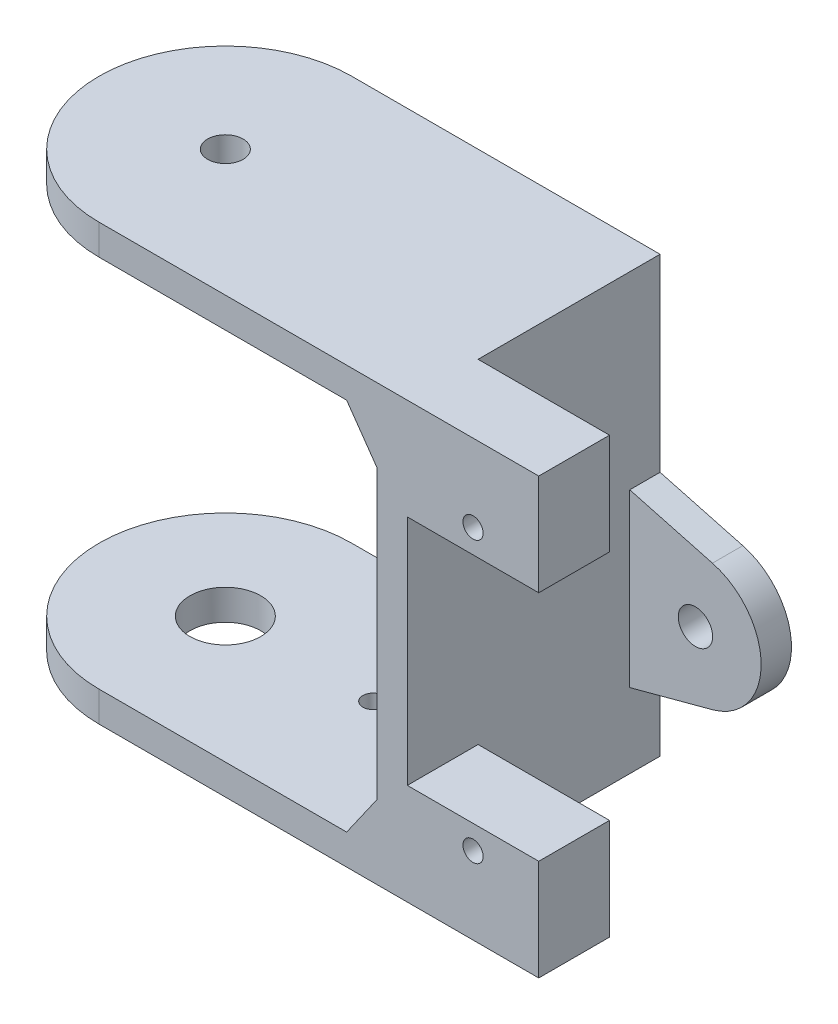
ISO-10303-21;
HEADER;
FILE_DESCRIPTION(('STEP AP214'),'2;1');
FILE_NAME('part.step','',(''),(''),'','','');
FILE_SCHEMA(('AUTOMOTIVE_DESIGN { 1 0 10303 214 1 1 1 1 }'));
ENDSEC;
DATA;
#1=APPLICATION_CONTEXT('core data for automotive mechanical design processes');
#2=APPLICATION_PROTOCOL_DEFINITION('international standard','automotive_design',2000,#1);
#3=PRODUCT_CONTEXT('',#1,'mechanical');
#4=PRODUCT('Part','Part','',(#3));
#5=PRODUCT_RELATED_PRODUCT_CATEGORY('part','',(#4));
#6=PRODUCT_DEFINITION_FORMATION('','',#4);
#7=PRODUCT_DEFINITION_CONTEXT('part definition',#1,'design');
#8=PRODUCT_DEFINITION('design','',#6,#7);
#9=PRODUCT_DEFINITION_SHAPE('','',#8);
#10=(LENGTH_UNIT() NAMED_UNIT(*) SI_UNIT(.MILLI.,.METRE.));
#11=(NAMED_UNIT(*) PLANE_ANGLE_UNIT() SI_UNIT($,.RADIAN.));
#12=(NAMED_UNIT(*) SI_UNIT($,.STERADIAN.) SOLID_ANGLE_UNIT());
#13=UNCERTAINTY_MEASURE_WITH_UNIT(LENGTH_MEASURE(1.E-05),#10,'distance_accuracy_value','');
#14=(GEOMETRIC_REPRESENTATION_CONTEXT(3) GLOBAL_UNCERTAINTY_ASSIGNED_CONTEXT((#13)) GLOBAL_UNIT_ASSIGNED_CONTEXT((#10,
#11,#12)) REPRESENTATION_CONTEXT('',''));
#15=CARTESIAN_POINT('',(0.,0.,0.));
#16=DIRECTION('',(0.,0.,1.));
#17=DIRECTION('',(1.,0.,0.));
#18=AXIS2_PLACEMENT_3D('',#15,#16,#17);
#19=CARTESIAN_POINT('',(-43.,21.5,12.5));
#20=DIRECTION('',(0.,1.,0.));
#21=DIRECTION('',(1.,0.,0.));
#22=AXIS2_PLACEMENT_3D('',#19,#20,#21);
#23=PLANE('',#22);
#24=DIRECTION('',(0.,0.,-1.));
#25=VECTOR('',#24,1.);
#26=CARTESIAN_POINT('',(13.,21.5,12.5));
#27=LINE('',#26,#25);
#28=CARTESIAN_POINT('',(13.,21.5,12.5));
#29=VERTEX_POINT('',#28);
#30=CARTESIAN_POINT('',(13.,21.4999999999999,5.5));
#31=VERTEX_POINT('',#30);
#32=EDGE_CURVE('E413',#29,#31,#27,.T.);
#33=ORIENTED_EDGE('',*,*,#32,.F.);
#34=DIRECTION('',(-1.,0.,0.));
#35=VECTOR('',#34,1.);
#36=CARTESIAN_POINT('',(0.,21.5,12.5));
#37=LINE('',#36,#35);
#38=CARTESIAN_POINT('',(-30.5,21.5,12.5));
#39=VERTEX_POINT('',#38);
#40=EDGE_CURVE('E408',#29,#39,#37,.T.);
#41=ORIENTED_EDGE('',*,*,#40,.T.);
#42=CARTESIAN_POINT('',(-30.5,21.5,0.));
#43=DIRECTION('',(0.,-1.,0.));
#44=DIRECTION('',(0.,0.,1.));
#45=AXIS2_PLACEMENT_3D('',#42,#43,#44);
#46=CIRCLE('',#45,12.5);
#47=CARTESIAN_POINT('',(-30.5,21.5,-12.5));
#48=VERTEX_POINT('',#47);
#49=EDGE_CURVE('E362',#39,#48,#46,.T.);
#50=ORIENTED_EDGE('',*,*,#49,.T.);
#51=DIRECTION('',(-1.,0.,0.));
#52=VECTOR('',#51,1.);
#53=CARTESIAN_POINT('',(-43.,21.5,-12.5));
#54=LINE('',#53,#52);
#55=CARTESIAN_POINT('',(0.,21.5,-12.5));
#56=VERTEX_POINT('',#55);
#57=EDGE_CURVE('E426',#56,#48,#54,.T.);
#58=ORIENTED_EDGE('',*,*,#57,.F.);
#59=DIRECTION('',(0.,0.,1.));
#60=VECTOR('',#59,1.);
#61=CARTESIAN_POINT('',(0.,21.5,5.5));
#62=LINE('',#61,#60);
#63=CARTESIAN_POINT('',(0.,21.5,5.5));
#64=VERTEX_POINT('',#63);
#65=EDGE_CURVE('E328',#56,#64,#62,.T.);
#66=ORIENTED_EDGE('',*,*,#65,.T.);
#67=DIRECTION('',(1.,0.,0.));
#68=VECTOR('',#67,1.);
#69=CARTESIAN_POINT('',(13.,21.4999999999999,5.5));
#70=LINE('',#69,#68);
#71=EDGE_CURVE('E336',#64,#31,#70,.T.);
#72=ORIENTED_EDGE('',*,*,#71,.T.);
#73=EDGE_LOOP('',(#33,#41,#50,#58,#66,#72));
#74=FACE_BOUND('',#73,.T.);
#75=CARTESIAN_POINT('',(-30.5,21.5,0.));
#76=DIRECTION('',(0.,1.,0.));
#77=DIRECTION('',(0.,0.,1.));
#78=AXIS2_PLACEMENT_3D('',#75,#76,#77);
#79=CIRCLE('',#78,3.5);
#80=CARTESIAN_POINT('',(-30.5,21.5,3.5));
#81=VERTEX_POINT('',#80);
#82=EDGE_CURVE('E373',#81,#81,#79,.T.);
#83=ORIENTED_EDGE('',*,*,#82,.T.);
#84=EDGE_LOOP('',(#83));
#85=FACE_BOUND('',#84,.T.);
#86=CARTESIAN_POINT('',(-15.9,21.5,0.));
#87=DIRECTION('',(0.,1.,0.));
#88=DIRECTION('',(0.,0.,1.));
#89=AXIS2_PLACEMENT_3D('',#86,#87,#88);
#90=CIRCLE('',#89,0.999999999999998);
#91=CARTESIAN_POINT('',(-15.9,21.5,1.));
#92=VERTEX_POINT('',#91);
#93=EDGE_CURVE('E363',#92,#92,#90,.T.);
#94=ORIENTED_EDGE('',*,*,#93,.T.);
#95=EDGE_LOOP('',(#94));
#96=FACE_BOUND('',#95,.T.);
#97=DIRECTION('',(0.,0.,-1.));
#98=VECTOR('',#97,1.);
#99=CARTESIAN_POINT('',(-8.00000000000001,21.5,5.7573593128806));
#100=LINE('',#99,#98);
#101=CARTESIAN_POINT('',(-8.00000000000001,21.5,10.));
#102=VERTEX_POINT('',#101);
#103=CARTESIAN_POINT('',(-8.00000000000001,21.5,5.7573593128806));
#104=VERTEX_POINT('',#103);
#105=EDGE_CURVE('E234',#102,#104,#100,.T.);
#106=ORIENTED_EDGE('',*,*,#105,.F.);
#107=DIRECTION('',(1.,0.,0.));
#108=VECTOR('',#107,1.);
#109=CARTESIAN_POINT('',(-8.00000000000001,21.5,10.));
#110=LINE('',#109,#108);
#111=CARTESIAN_POINT('',(-4.00000000000001,21.5,10.));
#112=VERTEX_POINT('',#111);
#113=EDGE_CURVE('E270',#102,#112,#110,.T.);
#114=ORIENTED_EDGE('',*,*,#113,.T.);
#115=DIRECTION('',(0.,0.,-1.));
#116=VECTOR('',#115,1.);
#117=CARTESIAN_POINT('',(-4.00000000000001,21.5,5.7573593128806));
#118=LINE('',#117,#116);
#119=CARTESIAN_POINT('',(-4.00000000000001,21.5,5.7573593128806));
#120=VERTEX_POINT('',#119);
#121=EDGE_CURVE('E239',#112,#120,#118,.T.);
#122=ORIENTED_EDGE('',*,*,#121,.T.);
#123=DIRECTION('',(1.,0.,0.));
#124=VECTOR('',#123,1.);
#125=CARTESIAN_POINT('',(-8.00000000000001,21.5,5.7573593128806));
#126=LINE('',#125,#124);
#127=EDGE_CURVE('E226',#104,#120,#126,.T.);
#128=ORIENTED_EDGE('',*,*,#127,.F.);
#129=EDGE_LOOP('',(#106,#114,#122,#128));
#130=FACE_BOUND('',#129,.T.);
#131=ADVANCED_FACE('F35',(#74,#85,#96,#130),#23,.F.);
#132=CARTESIAN_POINT('',(-43.,61.5,12.5));
#133=DIRECTION('',(0.,1.,0.));
#134=DIRECTION('',(1.,0.,0.));
#135=AXIS2_PLACEMENT_3D('',#132,#133,#134);
#136=PLANE('',#135);
#137=CARTESIAN_POINT('',(-30.5,61.5,0.));
#138=DIRECTION('',(0.,1.,0.));
#139=DIRECTION('',(0.,0.,1.));
#140=AXIS2_PLACEMENT_3D('',#137,#138,#139);
#141=CIRCLE('',#140,1.75);
#142=CARTESIAN_POINT('',(-30.5,61.5,1.75000000000001));
#143=VERTEX_POINT('',#142);
#144=EDGE_CURVE('E297',#143,#143,#141,.T.);
#145=ORIENTED_EDGE('',*,*,#144,.T.);
#146=EDGE_LOOP('',(#145));
#147=FACE_BOUND('',#146,.T.);
#148=CARTESIAN_POINT('',(-30.5,61.5,0.));
#149=DIRECTION('',(0.,-1.,0.));
#150=DIRECTION('',(1.,0.,0.));
#151=AXIS2_PLACEMENT_3D('',#148,#149,#150);
#152=CIRCLE('',#151,12.5);
#153=CARTESIAN_POINT('',(-30.5,61.5,12.5));
#154=VERTEX_POINT('',#153);
#155=CARTESIAN_POINT('',(-30.5,61.5,-12.5));
#156=VERTEX_POINT('',#155);
#157=EDGE_CURVE('E293',#154,#156,#152,.T.);
#158=ORIENTED_EDGE('',*,*,#157,.T.);
#159=DIRECTION('',(-1.,0.,0.));
#160=VECTOR('',#159,1.);
#161=CARTESIAN_POINT('',(-43.,61.5,-12.5));
#162=LINE('',#161,#160);
#163=CARTESIAN_POINT('',(-6.,61.5,-12.5));
#164=VERTEX_POINT('',#163);
#165=EDGE_CURVE('E416',#164,#156,#162,.T.);
#166=ORIENTED_EDGE('',*,*,#165,.F.);
#167=DIRECTION('',(0.,0.,-1.));
#168=VECTOR('',#167,1.);
#169=CARTESIAN_POINT('',(-6.,61.5,-12.5));
#170=LINE('',#169,#168);
#171=CARTESIAN_POINT('',(-6.,61.5,12.5));
#172=VERTEX_POINT('',#171);
#173=EDGE_CURVE('E452',#172,#164,#170,.T.);
#174=ORIENTED_EDGE('',*,*,#173,.F.);
#175=DIRECTION('',(-1.,0.,0.));
#176=VECTOR('',#175,1.);
#177=CARTESIAN_POINT('',(-43.,61.5,12.5));
#178=LINE('',#177,#176);
#179=EDGE_CURVE('E387',#172,#154,#178,.T.);
#180=ORIENTED_EDGE('',*,*,#179,.T.);
#181=EDGE_LOOP('',(#158,#166,#174,#180));
#182=FACE_BOUND('',#181,.T.);
#183=ADVANCED_FACE('F494',(#147,#182),#136,.F.);
#184=CARTESIAN_POINT('',(0.,64.5,12.5));
#185=DIRECTION('',(0.,-1.,0.));
#186=DIRECTION('',(0.,0.,1.));
#187=AXIS2_PLACEMENT_3D('',#184,#185,#186);
#188=PLANE('',#187);
#189=CARTESIAN_POINT('',(-30.5,64.5,0.));
#190=DIRECTION('',(0.,1.,0.));
#191=DIRECTION('',(0.,0.,1.));
#192=AXIS2_PLACEMENT_3D('',#189,#190,#191);
#193=CIRCLE('',#192,1.75);
#194=CARTESIAN_POINT('',(-30.5,64.5,1.75000000000001));
#195=VERTEX_POINT('',#194);
#196=EDGE_CURVE('E39',#195,#195,#193,.T.);
#197=ORIENTED_EDGE('',*,*,#196,.F.);
#198=EDGE_LOOP('',(#197));
#199=FACE_BOUND('',#198,.T.);
#200=CARTESIAN_POINT('',(-30.5,64.5,0.));
#201=DIRECTION('',(0.,1.,0.));
#202=DIRECTION('',(0.,0.,1.));
#203=AXIS2_PLACEMENT_3D('',#200,#201,#202);
#204=CIRCLE('',#203,12.5);
#205=CARTESIAN_POINT('',(-30.5,64.5,-12.5));
#206=VERTEX_POINT('',#205);
#207=CARTESIAN_POINT('',(-30.5,64.5,12.5));
#208=VERTEX_POINT('',#207);
#209=EDGE_CURVE('E272',#206,#208,#204,.T.);
#210=ORIENTED_EDGE('',*,*,#209,.T.);
#211=DIRECTION('',(1.,0.,0.));
#212=VECTOR('',#211,1.);
#213=CARTESIAN_POINT('',(0.,64.5,12.5));
#214=LINE('',#213,#212);
#215=CARTESIAN_POINT('',(13.,64.5,12.5));
#216=VERTEX_POINT('',#215);
#217=EDGE_CURVE('E391',#208,#216,#214,.T.);
#218=ORIENTED_EDGE('',*,*,#217,.T.);
#219=DIRECTION('',(0.,0.,-1.));
#220=VECTOR('',#219,1.);
#221=CARTESIAN_POINT('',(13.,64.5,12.5));
#222=LINE('',#221,#220);
#223=CARTESIAN_POINT('',(13.,64.5,5.5));
#224=VERTEX_POINT('',#223);
#225=EDGE_CURVE('E445',#216,#224,#222,.T.);
#226=ORIENTED_EDGE('',*,*,#225,.T.);
#227=DIRECTION('',(1.,0.,0.));
#228=VECTOR('',#227,1.);
#229=CARTESIAN_POINT('',(13.,64.5,5.5));
#230=LINE('',#229,#228);
#231=CARTESIAN_POINT('',(0.,64.5,5.5));
#232=VERTEX_POINT('',#231);
#233=EDGE_CURVE('E342',#232,#224,#230,.T.);
#234=ORIENTED_EDGE('',*,*,#233,.F.);
#235=DIRECTION('',(0.,0.,1.));
#236=VECTOR('',#235,1.);
#237=CARTESIAN_POINT('',(0.,64.5,5.5));
#238=LINE('',#237,#236);
#239=CARTESIAN_POINT('',(0.,64.5,-12.5));
#240=VERTEX_POINT('',#239);
#241=EDGE_CURVE('E339',#240,#232,#238,.T.);
#242=ORIENTED_EDGE('',*,*,#241,.F.);
#243=DIRECTION('',(1.,0.,0.));
#244=VECTOR('',#243,1.);
#245=CARTESIAN_POINT('',(0.,64.5,-12.5));
#246=LINE('',#245,#244);
#247=EDGE_CURVE('E419',#206,#240,#246,.T.);
#248=ORIENTED_EDGE('',*,*,#247,.F.);
#249=EDGE_LOOP('',(#210,#218,#226,#234,#242,#248));
#250=FACE_BOUND('',#249,.T.);
#251=ADVANCED_FACE('F503',(#199,#250),#188,.F.);
#252=CARTESIAN_POINT('',(0.,43.,12.5));
#253=DIRECTION('',(0.,0.,1.));
#254=DIRECTION('',(1.,0.,0.));
#255=AXIS2_PLACEMENT_3D('',#252,#253,#254);
#256=PLANE('',#255);
#257=DIRECTION('',(0.,-1.,0.));
#258=VECTOR('',#257,1.);
#259=CARTESIAN_POINT('',(-30.5,64.5,12.5));
#260=LINE('',#259,#258);
#261=EDGE_CURVE('E290',#208,#154,#260,.T.);
#262=ORIENTED_EDGE('',*,*,#261,.T.);
#263=ORIENTED_EDGE('',*,*,#179,.F.);
#264=DIRECTION('',(0.573576436351043,-0.819152044288994,0.));
#265=VECTOR('',#264,1.);
#266=CARTESIAN_POINT('',(-6.,61.5,12.5));
#267=LINE('',#266,#265);
#268=CARTESIAN_POINT('',(-3.,57.2155559797736,12.5));
#269=VERTEX_POINT('',#268);
#270=EDGE_CURVE('E467',#269,#172,#267,.F.);
#271=ORIENTED_EDGE('',*,*,#270,.F.);
#272=DIRECTION('',(0.,1.,0.));
#273=VECTOR('',#272,1.);
#274=CARTESIAN_POINT('',(-3.,61.5,12.5));
#275=LINE('',#274,#273);
#276=CARTESIAN_POINT('',(-2.99999999999999,28.7844440202264,12.5));
#277=VERTEX_POINT('',#276);
#278=EDGE_CURVE('E384',#277,#269,#275,.T.);
#279=ORIENTED_EDGE('',*,*,#278,.F.);
#280=DIRECTION('',(-0.573576436351042,-0.819152044288995,0.));
#281=VECTOR('',#280,1.);
#282=CARTESIAN_POINT('',(-2.99999999999999,28.7844440202264,12.5));
#283=LINE('',#282,#281);
#284=CARTESIAN_POINT('',(-5.99999999999999,24.5,12.5));
#285=VERTEX_POINT('',#284);
#286=EDGE_CURVE('E11',#285,#277,#283,.F.);
#287=ORIENTED_EDGE('',*,*,#286,.F.);
#288=DIRECTION('',(1.,0.,0.));
#289=VECTOR('',#288,1.);
#290=CARTESIAN_POINT('',(-2.99999999999999,24.5,12.5));
#291=LINE('',#290,#289);
#292=CARTESIAN_POINT('',(-30.5,24.5,12.5));
#293=VERTEX_POINT('',#292);
#294=EDGE_CURVE('E411',#293,#285,#291,.T.);
#295=ORIENTED_EDGE('',*,*,#294,.F.);
#296=DIRECTION('',(0.,-1.,0.));
#297=VECTOR('',#296,1.);
#298=CARTESIAN_POINT('',(-30.5,36.5,12.5));
#299=LINE('',#298,#297);
#300=EDGE_CURVE('E367',#293,#39,#299,.T.);
#301=ORIENTED_EDGE('',*,*,#300,.T.);
#302=ORIENTED_EDGE('',*,*,#40,.F.);
#303=DIRECTION('',(0.,-1.,0.));
#304=VECTOR('',#303,1.);
#305=CARTESIAN_POINT('',(13.,21.5,12.5));
#306=LINE('',#305,#304);
#307=CARTESIAN_POINT('',(13.,31.5,12.5));
#308=VERTEX_POINT('',#307);
#309=EDGE_CURVE('E406',#308,#29,#306,.T.);
#310=ORIENTED_EDGE('',*,*,#309,.F.);
#311=DIRECTION('',(1.,0.,0.));
#312=VECTOR('',#311,1.);
#313=CARTESIAN_POINT('',(13.,31.5,12.5));
#314=LINE('',#313,#312);
#315=CARTESIAN_POINT('',(0.,31.5,12.5));
#316=VERTEX_POINT('',#315);
#317=EDGE_CURVE('E403',#316,#308,#314,.T.);
#318=ORIENTED_EDGE('',*,*,#317,.F.);
#319=DIRECTION('',(0.,-1.,0.));
#320=VECTOR('',#319,1.);
#321=CARTESIAN_POINT('',(0.,31.5,12.5));
#322=LINE('',#321,#320);
#323=CARTESIAN_POINT('',(0.,54.5,12.5));
#324=VERTEX_POINT('',#323);
#325=EDGE_CURVE('E400',#324,#316,#322,.T.);
#326=ORIENTED_EDGE('',*,*,#325,.F.);
#327=DIRECTION('',(-1.,0.,0.));
#328=VECTOR('',#327,1.);
#329=CARTESIAN_POINT('',(13.,54.5,12.5));
#330=LINE('',#329,#328);
#331=CARTESIAN_POINT('',(13.,54.5,12.5));
#332=VERTEX_POINT('',#331);
#333=EDGE_CURVE('E397',#332,#324,#330,.T.);
#334=ORIENTED_EDGE('',*,*,#333,.F.);
#335=DIRECTION('',(0.,-1.,0.));
#336=VECTOR('',#335,1.);
#337=CARTESIAN_POINT('',(13.,64.5,12.5));
#338=LINE('',#337,#336);
#339=EDGE_CURVE('E394',#216,#332,#338,.T.);
#340=ORIENTED_EDGE('',*,*,#339,.F.);
#341=ORIENTED_EDGE('',*,*,#217,.F.);
#342=EDGE_LOOP('',(#262,#263,#271,#279,#287,#295,#301,#302,#310,#318,#326,#334,#340,#341));
#343=FACE_BOUND('',#342,.T.);
#344=CARTESIAN_POINT('',(6.49999999999999,29.15,12.5));
#345=DIRECTION('',(0.,0.,-1.));
#346=DIRECTION('',(1.,0.,0.));
#347=AXIS2_PLACEMENT_3D('',#344,#345,#346);
#348=CIRCLE('',#347,1.);
#349=CARTESIAN_POINT('',(7.5,29.15,12.5));
#350=VERTEX_POINT('',#349);
#351=EDGE_CURVE('E380',#350,#350,#348,.T.);
#352=ORIENTED_EDGE('',*,*,#351,.T.);
#353=EDGE_LOOP('',(#352));
#354=FACE_BOUND('',#353,.T.);
#355=CARTESIAN_POINT('',(6.49999999999998,56.85,12.5));
#356=DIRECTION('',(0.,0.,-1.));
#357=DIRECTION('',(-1.,0.,0.));
#358=AXIS2_PLACEMENT_3D('',#355,#356,#357);
#359=CIRCLE('',#358,1.);
#360=CARTESIAN_POINT('',(5.49999999999998,56.85,12.5));
#361=VERTEX_POINT('',#360);
#362=EDGE_CURVE('E377',#361,#361,#359,.T.);
#363=ORIENTED_EDGE('',*,*,#362,.T.);
#364=EDGE_LOOP('',(#363));
#365=FACE_BOUND('',#364,.T.);
#366=ADVANCED_FACE('F483',(#343,#354,#365),#256,.T.);
#367=CARTESIAN_POINT('',(0.,43.,-12.5));
#368=DIRECTION('',(0.,0.,1.));
#369=DIRECTION('',(1.,0.,0.));
#370=AXIS2_PLACEMENT_3D('',#367,#368,#369);
#371=PLANE('',#370);
#372=ORIENTED_EDGE('',*,*,#247,.T.);
#373=DIRECTION('',(0.,-1.,0.));
#374=VECTOR('',#373,1.);
#375=CARTESIAN_POINT('',(0.,31.5,-12.5));
#376=LINE('',#375,#374);
#377=CARTESIAN_POINT('',(0.,45.8209649234678,-12.5));
#378=VERTEX_POINT('',#377);
#379=EDGE_CURVE('E423',#240,#378,#376,.T.);
#380=ORIENTED_EDGE('',*,*,#379,.T.);
#381=DIRECTION('',(-0.965925826289069,0.258819045102517,0.));
#382=VECTOR('',#381,1.);
#383=CARTESIAN_POINT('',(8.18232379316636,43.6285178708789,-12.5));
#384=LINE('',#383,#382);
#385=CARTESIAN_POINT('',(8.18232379316636,43.6285178708789,-12.5));
#386=VERTEX_POINT('',#385);
#387=EDGE_CURVE('E321',#386,#378,#384,.T.);
#388=ORIENTED_EDGE('',*,*,#387,.F.);
#389=CARTESIAN_POINT('',(6.49999999999999,37.35,-12.5));
#390=DIRECTION('',(0.,0.,1.));
#391=DIRECTION('',(-1.,0.,0.));
#392=AXIS2_PLACEMENT_3D('',#389,#390,#391);
#393=CIRCLE('',#392,6.5);
#394=CARTESIAN_POINT('',(8.18232379316636,31.071482129121,-12.5));
#395=VERTEX_POINT('',#394);
#396=EDGE_CURVE('E303',#395,#386,#393,.T.);
#397=ORIENTED_EDGE('',*,*,#396,.F.);
#398=DIRECTION('',(0.965925826289069,0.258819045102519,0.));
#399=VECTOR('',#398,1.);
#400=CARTESIAN_POINT('',(8.18232379316636,31.071482129121,-12.5));
#401=LINE('',#400,#399);
#402=CARTESIAN_POINT('',(0.,28.8790350765322,-12.5));
#403=VERTEX_POINT('',#402);
#404=EDGE_CURVE('E311',#403,#395,#401,.T.);
#405=ORIENTED_EDGE('',*,*,#404,.F.);
#406=EDGE_CURVE('E422',#403,#56,#376,.T.);
#407=ORIENTED_EDGE('',*,*,#406,.T.);
#408=ORIENTED_EDGE('',*,*,#57,.T.);
#409=DIRECTION('',(0.,-1.,0.));
#410=VECTOR('',#409,1.);
#411=CARTESIAN_POINT('',(-30.5,36.5,-12.5));
#412=LINE('',#411,#410);
#413=CARTESIAN_POINT('',(-30.5,24.5,-12.5));
#414=VERTEX_POINT('',#413);
#415=EDGE_CURVE('E370',#414,#48,#412,.T.);
#416=ORIENTED_EDGE('',*,*,#415,.F.);
#417=DIRECTION('',(1.,0.,0.));
#418=VECTOR('',#417,1.);
#419=CARTESIAN_POINT('',(-2.99999999999999,24.5,-12.5));
#420=LINE('',#419,#418);
#421=CARTESIAN_POINT('',(-5.99999999999999,24.5,-12.5));
#422=VERTEX_POINT('',#421);
#423=EDGE_CURVE('E388',#414,#422,#420,.T.);
#424=ORIENTED_EDGE('',*,*,#423,.T.);
#425=DIRECTION('',(0.573576436351042,0.819152044288995,0.));
#426=VECTOR('',#425,1.);
#427=CARTESIAN_POINT('',(4.66609631229259,39.7327641881202,-12.5));
#428=LINE('',#427,#426);
#429=CARTESIAN_POINT('',(-2.99999999999999,28.7844440202264,-12.5));
#430=VERTEX_POINT('',#429);
#431=EDGE_CURVE('E44',#430,#422,#428,.F.);
#432=ORIENTED_EDGE('',*,*,#431,.F.);
#433=DIRECTION('',(0.,1.,0.));
#434=VECTOR('',#433,1.);
#435=CARTESIAN_POINT('',(-3.,61.5,-12.5));
#436=LINE('',#435,#434);
#437=CARTESIAN_POINT('',(-3.,57.2155559797736,-12.5));
#438=VERTEX_POINT('',#437);
#439=EDGE_CURVE('E383',#430,#438,#436,.T.);
#440=ORIENTED_EDGE('',*,*,#439,.T.);
#441=DIRECTION('',(-0.573576436351043,0.819152044288994,0.));
#442=VECTOR('',#441,1.);
#443=CARTESIAN_POINT('',(4.66609631229259,46.2672358118798,-12.5));
#444=LINE('',#443,#442);
#445=EDGE_CURVE('E464',#164,#438,#444,.F.);
#446=ORIENTED_EDGE('',*,*,#445,.F.);
#447=ORIENTED_EDGE('',*,*,#165,.T.);
#448=DIRECTION('',(0.,-1.,0.));
#449=VECTOR('',#448,1.);
#450=CARTESIAN_POINT('',(-30.5,64.5,-12.5));
#451=LINE('',#450,#449);
#452=EDGE_CURVE('E291',#206,#156,#451,.T.);
#453=ORIENTED_EDGE('',*,*,#452,.F.);
#454=EDGE_LOOP('',(#372,#380,#388,#397,#405,#407,#408,#416,#424,#432,#440,#446,#447,#453));
#455=FACE_BOUND('',#454,.T.);
#456=CARTESIAN_POINT('',(6.49999999999999,37.35,-12.5));
#457=DIRECTION('',(0.,0.,1.));
#458=DIRECTION('',(-1.,0.,0.));
#459=AXIS2_PLACEMENT_3D('',#456,#457,#458);
#460=CIRCLE('',#459,1.7);
#461=CARTESIAN_POINT('',(4.8,37.35,-12.5));
#462=VERTEX_POINT('',#461);
#463=EDGE_CURVE('E304',#462,#462,#460,.T.);
#464=ORIENTED_EDGE('',*,*,#463,.T.);
#465=EDGE_LOOP('',(#464));
#466=FACE_BOUND('',#465,.T.);
#467=ADVANCED_FACE('F474',(#455,#466),#371,.F.);
#468=CARTESIAN_POINT('',(-3.,61.5,12.5));
#469=DIRECTION('',(1.,0.,0.));
#470=DIRECTION('',(0.,0.,-1.));
#471=AXIS2_PLACEMENT_3D('',#468,#469,#470);
#472=PLANE('',#471);
#473=ORIENTED_EDGE('',*,*,#439,.F.);
#474=DIRECTION('',(0.,0.,-1.));
#475=VECTOR('',#474,1.);
#476=CARTESIAN_POINT('',(-2.99999999999999,28.7844440202264,-12.5));
#477=LINE('',#476,#475);
#478=EDGE_CURVE('E459',#277,#430,#477,.T.);
#479=ORIENTED_EDGE('',*,*,#478,.F.);
#480=ORIENTED_EDGE('',*,*,#278,.T.);
#481=DIRECTION('',(0.,0.,1.));
#482=VECTOR('',#481,1.);
#483=CARTESIAN_POINT('',(-3.,57.2155559797736,12.5));
#484=LINE('',#483,#482);
#485=EDGE_CURVE('E461',#438,#269,#484,.T.);
#486=ORIENTED_EDGE('',*,*,#485,.F.);
#487=EDGE_LOOP('',(#473,#479,#480,#486));
#488=FACE_BOUND('',#487,.T.);
#489=ADVANCED_FACE('F488',(#488),#472,.F.);
#490=CARTESIAN_POINT('',(13.,64.5,12.5));
#491=DIRECTION('',(-1.,0.,0.));
#492=DIRECTION('',(0.,1.,0.));
#493=AXIS2_PLACEMENT_3D('',#490,#491,#492);
#494=PLANE('',#493);
#495=ORIENTED_EDGE('',*,*,#225,.F.);
#496=ORIENTED_EDGE('',*,*,#339,.T.);
#497=DIRECTION('',(0.,0.,-1.));
#498=VECTOR('',#497,1.);
#499=CARTESIAN_POINT('',(13.,54.5,12.5));
#500=LINE('',#499,#498);
#501=CARTESIAN_POINT('',(13.,54.5,5.5));
#502=VERTEX_POINT('',#501);
#503=EDGE_CURVE('E442',#332,#502,#500,.T.);
#504=ORIENTED_EDGE('',*,*,#503,.T.);
#505=DIRECTION('',(0.,-1.,0.));
#506=VECTOR('',#505,1.);
#507=CARTESIAN_POINT('',(13.,64.5,5.5));
#508=LINE('',#507,#506);
#509=EDGE_CURVE('E346',#224,#502,#508,.T.);
#510=ORIENTED_EDGE('',*,*,#509,.F.);
#511=EDGE_LOOP('',(#495,#496,#504,#510));
#512=FACE_BOUND('',#511,.T.);
#513=ADVANCED_FACE('F546',(#512),#494,.F.);
#514=CARTESIAN_POINT('',(13.,54.5,12.5));
#515=DIRECTION('',(0.,1.,0.));
#516=DIRECTION('',(1.,0.,0.));
#517=AXIS2_PLACEMENT_3D('',#514,#515,#516);
#518=PLANE('',#517);
#519=ORIENTED_EDGE('',*,*,#503,.F.);
#520=ORIENTED_EDGE('',*,*,#333,.T.);
#521=DIRECTION('',(0.,0.,-1.));
#522=VECTOR('',#521,1.);
#523=CARTESIAN_POINT('',(0.,54.5,12.5));
#524=LINE('',#523,#522);
#525=CARTESIAN_POINT('',(0.,54.5,5.5));
#526=VERTEX_POINT('',#525);
#527=EDGE_CURVE('E439',#324,#526,#524,.T.);
#528=ORIENTED_EDGE('',*,*,#527,.T.);
#529=DIRECTION('',(-1.,0.,0.));
#530=VECTOR('',#529,1.);
#531=CARTESIAN_POINT('',(13.,54.5,5.5));
#532=LINE('',#531,#530);
#533=EDGE_CURVE('E359',#502,#526,#532,.T.);
#534=ORIENTED_EDGE('',*,*,#533,.F.);
#535=EDGE_LOOP('',(#519,#520,#528,#534));
#536=FACE_BOUND('',#535,.T.);
#537=ADVANCED_FACE('F543',(#536),#518,.F.);
#538=CARTESIAN_POINT('',(0.,31.5,12.5));
#539=DIRECTION('',(-1.,0.,0.));
#540=DIRECTION('',(0.,1.,0.));
#541=AXIS2_PLACEMENT_3D('',#538,#539,#540);
#542=PLANE('',#541);
#543=DIRECTION('',(0.,-1.,0.));
#544=VECTOR('',#543,1.);
#545=CARTESIAN_POINT('',(0.,28.8790350765322,-9.5));
#546=LINE('',#545,#544);
#547=CARTESIAN_POINT('',(0.,45.8209649234678,-9.5));
#548=VERTEX_POINT('',#547);
#549=CARTESIAN_POINT('',(0.,28.8790350765322,-9.5));
#550=VERTEX_POINT('',#549);
#551=EDGE_CURVE('E313',#548,#550,#546,.T.);
#552=ORIENTED_EDGE('',*,*,#551,.F.);
#553=DIRECTION('',(0.,0.,-1.));
#554=VECTOR('',#553,1.);
#555=CARTESIAN_POINT('',(0.,45.8209649234678,-9.5));
#556=LINE('',#555,#554);
#557=EDGE_CURVE('E331',#548,#378,#556,.T.);
#558=ORIENTED_EDGE('',*,*,#557,.T.);
#559=ORIENTED_EDGE('',*,*,#379,.F.);
#560=ORIENTED_EDGE('',*,*,#241,.T.);
#561=DIRECTION('',(0.,-1.,0.));
#562=VECTOR('',#561,1.);
#563=CARTESIAN_POINT('',(0.,64.5,5.5));
#564=LINE('',#563,#562);
#565=EDGE_CURVE('E351',#232,#526,#564,.T.);
#566=ORIENTED_EDGE('',*,*,#565,.T.);
#567=ORIENTED_EDGE('',*,*,#527,.F.);
#568=ORIENTED_EDGE('',*,*,#325,.T.);
#569=DIRECTION('',(0.,0.,-1.));
#570=VECTOR('',#569,1.);
#571=CARTESIAN_POINT('',(0.,31.5,12.5));
#572=LINE('',#571,#570);
#573=CARTESIAN_POINT('',(0.,31.5,5.5));
#574=VERTEX_POINT('',#573);
#575=EDGE_CURVE('E436',#316,#574,#572,.T.);
#576=ORIENTED_EDGE('',*,*,#575,.T.);
#577=EDGE_CURVE('E345',#574,#64,#564,.T.);
#578=ORIENTED_EDGE('',*,*,#577,.T.);
#579=ORIENTED_EDGE('',*,*,#65,.F.);
#580=ORIENTED_EDGE('',*,*,#406,.F.);
#581=DIRECTION('',(0.,0.,-1.));
#582=VECTOR('',#581,1.);
#583=CARTESIAN_POINT('',(0.,28.8790350765322,-9.5));
#584=LINE('',#583,#582);
#585=EDGE_CURVE('E329',#550,#403,#584,.T.);
#586=ORIENTED_EDGE('',*,*,#585,.F.);
#587=EDGE_LOOP('',(#552,#558,#559,#560,#566,#567,#568,#576,#578,#579,#580,#586));
#588=FACE_BOUND('',#587,.T.);
#589=ADVANCED_FACE('F507',(#588),#542,.F.);
#590=CARTESIAN_POINT('',(13.,31.5,12.5));
#591=DIRECTION('',(0.,-1.,0.));
#592=DIRECTION('',(-1.,0.,0.));
#593=AXIS2_PLACEMENT_3D('',#590,#591,#592);
#594=PLANE('',#593);
#595=ORIENTED_EDGE('',*,*,#575,.F.);
#596=ORIENTED_EDGE('',*,*,#317,.T.);
#597=DIRECTION('',(0.,0.,-1.));
#598=VECTOR('',#597,1.);
#599=CARTESIAN_POINT('',(13.,31.5,12.5));
#600=LINE('',#599,#598);
#601=CARTESIAN_POINT('',(13.,31.5,5.5));
#602=VERTEX_POINT('',#601);
#603=EDGE_CURVE('E433',#308,#602,#600,.T.);
#604=ORIENTED_EDGE('',*,*,#603,.T.);
#605=DIRECTION('',(1.,0.,0.));
#606=VECTOR('',#605,1.);
#607=CARTESIAN_POINT('',(13.,31.5,5.5));
#608=LINE('',#607,#606);
#609=EDGE_CURVE('E356',#574,#602,#608,.T.);
#610=ORIENTED_EDGE('',*,*,#609,.F.);
#611=EDGE_LOOP('',(#595,#596,#604,#610));
#612=FACE_BOUND('',#611,.T.);
#613=ADVANCED_FACE('F539',(#612),#594,.F.);
#614=CARTESIAN_POINT('',(13.,21.5,12.5));
#615=DIRECTION('',(-1.,0.,0.));
#616=DIRECTION('',(0.,1.,0.));
#617=AXIS2_PLACEMENT_3D('',#614,#615,#616);
#618=PLANE('',#617);
#619=ORIENTED_EDGE('',*,*,#603,.F.);
#620=ORIENTED_EDGE('',*,*,#309,.T.);
#621=ORIENTED_EDGE('',*,*,#32,.T.);
#622=EDGE_CURVE('E350',#602,#31,#508,.T.);
#623=ORIENTED_EDGE('',*,*,#622,.F.);
#624=EDGE_LOOP('',(#619,#620,#621,#623));
#625=FACE_BOUND('',#624,.T.);
#626=ADVANCED_FACE('F537',(#625),#618,.F.);
#627=CARTESIAN_POINT('',(-2.99999999999999,24.5,12.5));
#628=DIRECTION('',(0.,-1.,0.));
#629=DIRECTION('',(-1.,0.,0.));
#630=AXIS2_PLACEMENT_3D('',#627,#628,#629);
#631=PLANE('',#630);
#632=CARTESIAN_POINT('',(-15.9,24.5,0.));
#633=DIRECTION('',(0.,1.,0.));
#634=DIRECTION('',(-1.,0.,0.));
#635=AXIS2_PLACEMENT_3D('',#632,#633,#634);
#636=CIRCLE('',#635,0.999999999999998);
#637=CARTESIAN_POINT('',(-16.9,24.5,0.));
#638=VERTEX_POINT('',#637);
#639=EDGE_CURVE('E366',#638,#638,#636,.T.);
#640=ORIENTED_EDGE('',*,*,#639,.F.);
#641=EDGE_LOOP('',(#640));
#642=FACE_BOUND('',#641,.T.);
#643=CARTESIAN_POINT('',(-30.5,24.5,0.));
#644=DIRECTION('',(0.,1.,0.));
#645=DIRECTION('',(-1.,0.,0.));
#646=AXIS2_PLACEMENT_3D('',#643,#644,#645);
#647=CIRCLE('',#646,3.5);
#648=CARTESIAN_POINT('',(-34.,24.5,0.));
#649=VERTEX_POINT('',#648);
#650=EDGE_CURVE('E376',#649,#649,#647,.T.);
#651=ORIENTED_EDGE('',*,*,#650,.F.);
#652=EDGE_LOOP('',(#651));
#653=FACE_BOUND('',#652,.T.);
#654=ORIENTED_EDGE('',*,*,#423,.F.);
#655=CARTESIAN_POINT('',(-30.5,24.5,0.));
#656=DIRECTION('',(0.,1.,0.));
#657=DIRECTION('',(-1.,0.,0.));
#658=AXIS2_PLACEMENT_3D('',#655,#656,#657);
#659=CIRCLE('',#658,12.5);
#660=EDGE_CURVE('E448',#293,#414,#659,.F.);
#661=ORIENTED_EDGE('',*,*,#660,.F.);
#662=ORIENTED_EDGE('',*,*,#294,.T.);
#663=DIRECTION('',(0.,0.,1.));
#664=VECTOR('',#663,1.);
#665=CARTESIAN_POINT('',(-5.99999999999999,24.5,12.5));
#666=LINE('',#665,#664);
#667=EDGE_CURVE('E58',#422,#285,#666,.T.);
#668=ORIENTED_EDGE('',*,*,#667,.F.);
#669=EDGE_LOOP('',(#654,#661,#662,#668));
#670=FACE_BOUND('',#669,.T.);
#671=ADVANCED_FACE('F477',(#642,#653,#670),#631,.F.);
#672=CARTESIAN_POINT('',(6.49999999999999,29.15,12.5));
#673=DIRECTION('',(0.,0.,-1.));
#674=DIRECTION('',(-1.,0.,0.));
#675=AXIS2_PLACEMENT_3D('',#672,#673,#674);
#676=CYLINDRICAL_SURFACE('',#675,1.);
#677=CARTESIAN_POINT('',(6.49999999999999,29.15,5.5));
#678=DIRECTION('',(0.,0.,-1.));
#679=DIRECTION('',(1.,0.,0.));
#680=AXIS2_PLACEMENT_3D('',#677,#678,#679);
#681=CIRCLE('',#680,1.);
#682=CARTESIAN_POINT('',(7.5,29.15,5.5));
#683=VERTEX_POINT('',#682);
#684=EDGE_CURVE('E353',#683,#683,#681,.T.);
#685=ORIENTED_EDGE('',*,*,#684,.T.);
#686=EDGE_LOOP('',(#685));
#687=FACE_BOUND('',#686,.T.);
#688=ORIENTED_EDGE('',*,*,#351,.F.);
#689=EDGE_LOOP('',(#688));
#690=FACE_BOUND('',#689,.T.);
#691=ADVANCED_FACE('F804',(#687,#690),#676,.F.);
#692=CARTESIAN_POINT('',(6.49999999999998,56.85,12.5));
#693=DIRECTION('',(0.,0.,-1.));
#694=DIRECTION('',(-1.,0.,0.));
#695=AXIS2_PLACEMENT_3D('',#692,#693,#694);
#696=CYLINDRICAL_SURFACE('',#695,1.);
#697=CARTESIAN_POINT('',(6.49999999999998,56.85,5.5));
#698=DIRECTION('',(0.,0.,-1.));
#699=DIRECTION('',(1.,0.,0.));
#700=AXIS2_PLACEMENT_3D('',#697,#698,#699);
#701=CIRCLE('',#700,1.);
#702=CARTESIAN_POINT('',(7.49999999999999,56.85,5.5));
#703=VERTEX_POINT('',#702);
#704=EDGE_CURVE('E349',#703,#703,#701,.T.);
#705=ORIENTED_EDGE('',*,*,#704,.T.);
#706=EDGE_LOOP('',(#705));
#707=FACE_BOUND('',#706,.T.);
#708=ORIENTED_EDGE('',*,*,#362,.F.);
#709=EDGE_LOOP('',(#708));
#710=FACE_BOUND('',#709,.T.);
#711=ADVANCED_FACE('F795',(#707,#710),#696,.F.);
#712=CARTESIAN_POINT('',(-30.5,36.5,0.));
#713=DIRECTION('',(0.,-1.,0.));
#714=DIRECTION('',(0.,0.,1.));
#715=AXIS2_PLACEMENT_3D('',#712,#713,#714);
#716=CYLINDRICAL_SURFACE('',#715,3.5);
#717=ORIENTED_EDGE('',*,*,#82,.F.);
#718=EDGE_LOOP('',(#717));
#719=FACE_BOUND('',#718,.T.);
#720=ORIENTED_EDGE('',*,*,#650,.T.);
#721=EDGE_LOOP('',(#720));
#722=FACE_BOUND('',#721,.T.);
#723=ADVANCED_FACE('F787',(#719,#722),#716,.F.);
#724=CARTESIAN_POINT('',(-30.5,36.5,0.));
#725=DIRECTION('',(0.,-1.,0.));
#726=DIRECTION('',(0.,0.,1.));
#727=AXIS2_PLACEMENT_3D('',#724,#725,#726);
#728=CYLINDRICAL_SURFACE('',#727,12.5);
#729=ORIENTED_EDGE('',*,*,#49,.F.);
#730=ORIENTED_EDGE('',*,*,#300,.F.);
#731=ORIENTED_EDGE('',*,*,#660,.T.);
#732=ORIENTED_EDGE('',*,*,#415,.T.);
#733=EDGE_LOOP('',(#729,#730,#731,#732));
#734=FACE_BOUND('',#733,.T.);
#735=ADVANCED_FACE('F533',(#734),#728,.T.);
#736=CARTESIAN_POINT('',(-15.9,36.5,0.));
#737=DIRECTION('',(0.,-1.,0.));
#738=DIRECTION('',(0.,0.,1.));
#739=AXIS2_PLACEMENT_3D('',#736,#737,#738);
#740=CYLINDRICAL_SURFACE('',#739,0.999999999999998);
#741=ORIENTED_EDGE('',*,*,#93,.F.);
#742=EDGE_LOOP('',(#741));
#743=FACE_BOUND('',#742,.T.);
#744=ORIENTED_EDGE('',*,*,#639,.T.);
#745=EDGE_LOOP('',(#744));
#746=FACE_BOUND('',#745,.T.);
#747=ADVANCED_FACE('F551',(#743,#746),#740,.F.);
#748=CARTESIAN_POINT('',(13.,64.5,5.5));
#749=DIRECTION('',(0.,0.,1.));
#750=DIRECTION('',(1.,0.,0.));
#751=AXIS2_PLACEMENT_3D('',#748,#749,#750);
#752=PLANE('',#751);
#753=ORIENTED_EDGE('',*,*,#704,.F.);
#754=EDGE_LOOP('',(#753));
#755=FACE_BOUND('',#754,.T.);
#756=ORIENTED_EDGE('',*,*,#509,.T.);
#757=ORIENTED_EDGE('',*,*,#533,.T.);
#758=ORIENTED_EDGE('',*,*,#565,.F.);
#759=ORIENTED_EDGE('',*,*,#233,.T.);
#760=EDGE_LOOP('',(#756,#757,#758,#759));
#761=FACE_BOUND('',#760,.T.);
#762=ADVANCED_FACE('F548',(#755,#761),#752,.F.);
#763=ORIENTED_EDGE('',*,*,#684,.F.);
#764=EDGE_LOOP('',(#763));
#765=FACE_BOUND('',#764,.T.);
#766=ORIENTED_EDGE('',*,*,#577,.F.);
#767=ORIENTED_EDGE('',*,*,#609,.T.);
#768=ORIENTED_EDGE('',*,*,#622,.T.);
#769=ORIENTED_EDGE('',*,*,#71,.F.);
#770=EDGE_LOOP('',(#766,#767,#768,#769));
#771=FACE_BOUND('',#770,.T.);
#772=ADVANCED_FACE('F550',(#765,#771),#752,.F.);
#773=CARTESIAN_POINT('',(6.49999999999999,37.35,-9.5));
#774=DIRECTION('',(0.,0.,-1.));
#775=DIRECTION('',(-1.,0.,0.));
#776=AXIS2_PLACEMENT_3D('',#773,#774,#775);
#777=CYLINDRICAL_SURFACE('',#776,6.5);
#778=ORIENTED_EDGE('',*,*,#396,.T.);
#779=DIRECTION('',(0.,0.,-1.));
#780=VECTOR('',#779,1.);
#781=CARTESIAN_POINT('',(8.18232379316636,43.6285178708789,-9.5));
#782=LINE('',#781,#780);
#783=CARTESIAN_POINT('',(8.18232379316636,43.6285178708789,-9.5));
#784=VERTEX_POINT('',#783);
#785=EDGE_CURVE('E318',#784,#386,#782,.T.);
#786=ORIENTED_EDGE('',*,*,#785,.F.);
#787=CARTESIAN_POINT('',(6.49999999999999,37.35,-9.5));
#788=DIRECTION('',(0.,0.,1.));
#789=DIRECTION('',(-1.,0.,0.));
#790=AXIS2_PLACEMENT_3D('',#787,#788,#789);
#791=CIRCLE('',#790,6.5);
#792=CARTESIAN_POINT('',(8.18232379316636,31.071482129121,-9.5));
#793=VERTEX_POINT('',#792);
#794=EDGE_CURVE('E307',#793,#784,#791,.T.);
#795=ORIENTED_EDGE('',*,*,#794,.F.);
#796=DIRECTION('',(0.,0.,-1.));
#797=VECTOR('',#796,1.);
#798=CARTESIAN_POINT('',(8.18232379316636,31.071482129121,-9.5));
#799=LINE('',#798,#797);
#800=EDGE_CURVE('E326',#793,#395,#799,.T.);
#801=ORIENTED_EDGE('',*,*,#800,.T.);
#802=EDGE_LOOP('',(#778,#786,#795,#801));
#803=FACE_BOUND('',#802,.T.);
#804=ADVANCED_FACE('F517',(#803),#777,.T.);
#805=CARTESIAN_POINT('',(8.18232379316636,31.071482129121,-9.5));
#806=DIRECTION('',(0.258819045102519,-0.965925826289069,0.));
#807=DIRECTION('',(-0.965925826289069,-0.258819045102519,0.));
#808=AXIS2_PLACEMENT_3D('',#805,#806,#807);
#809=PLANE('',#808);
#810=ORIENTED_EDGE('',*,*,#404,.T.);
#811=ORIENTED_EDGE('',*,*,#800,.F.);
#812=DIRECTION('',(0.965925826289069,0.258819045102519,0.));
#813=VECTOR('',#812,1.);
#814=CARTESIAN_POINT('',(8.18232379316636,31.071482129121,-9.5));
#815=LINE('',#814,#813);
#816=EDGE_CURVE('E316',#550,#793,#815,.T.);
#817=ORIENTED_EDGE('',*,*,#816,.F.);
#818=ORIENTED_EDGE('',*,*,#585,.T.);
#819=EDGE_LOOP('',(#810,#811,#817,#818));
#820=FACE_BOUND('',#819,.T.);
#821=ADVANCED_FACE('F520',(#820),#809,.T.);
#822=CARTESIAN_POINT('',(8.18232379316636,43.6285178708789,-9.5));
#823=DIRECTION('',(0.258819045102517,0.965925826289069,0.));
#824=DIRECTION('',(0.965925826289069,-0.258819045102517,0.));
#825=AXIS2_PLACEMENT_3D('',#822,#823,#824);
#826=PLANE('',#825);
#827=ORIENTED_EDGE('',*,*,#387,.T.);
#828=ORIENTED_EDGE('',*,*,#557,.F.);
#829=DIRECTION('',(-0.965925826289069,0.258819045102517,0.));
#830=VECTOR('',#829,1.);
#831=CARTESIAN_POINT('',(8.18232379316636,43.6285178708789,-9.5));
#832=LINE('',#831,#830);
#833=EDGE_CURVE('E310',#784,#548,#832,.T.);
#834=ORIENTED_EDGE('',*,*,#833,.F.);
#835=ORIENTED_EDGE('',*,*,#785,.T.);
#836=EDGE_LOOP('',(#827,#828,#834,#835));
#837=FACE_BOUND('',#836,.T.);
#838=ADVANCED_FACE('F513',(#837),#826,.T.);
#839=CARTESIAN_POINT('',(6.49999999999999,37.35,-9.5));
#840=DIRECTION('',(0.,0.,-1.));
#841=DIRECTION('',(-1.,0.,0.));
#842=AXIS2_PLACEMENT_3D('',#839,#840,#841);
#843=PLANE('',#842);
#844=CARTESIAN_POINT('',(6.49999999999999,37.35,-9.5));
#845=DIRECTION('',(0.,0.,1.));
#846=DIRECTION('',(-1.,0.,0.));
#847=AXIS2_PLACEMENT_3D('',#844,#845,#846);
#848=CIRCLE('',#847,1.7);
#849=CARTESIAN_POINT('',(4.8,37.35,-9.5));
#850=VERTEX_POINT('',#849);
#851=EDGE_CURVE('E300',#850,#850,#848,.T.);
#852=ORIENTED_EDGE('',*,*,#851,.F.);
#853=EDGE_LOOP('',(#852));
#854=FACE_BOUND('',#853,.T.);
#855=ORIENTED_EDGE('',*,*,#794,.T.);
#856=ORIENTED_EDGE('',*,*,#833,.T.);
#857=ORIENTED_EDGE('',*,*,#551,.T.);
#858=ORIENTED_EDGE('',*,*,#816,.T.);
#859=EDGE_LOOP('',(#855,#856,#857,#858));
#860=FACE_BOUND('',#859,.T.);
#861=ADVANCED_FACE('F594',(#854,#860),#843,.F.);
#862=CARTESIAN_POINT('',(6.49999999999999,37.35,-9.5));
#863=DIRECTION('',(0.,0.,-1.));
#864=DIRECTION('',(-1.,0.,0.));
#865=AXIS2_PLACEMENT_3D('',#862,#863,#864);
#866=CYLINDRICAL_SURFACE('',#865,1.7);
#867=ORIENTED_EDGE('',*,*,#851,.T.);
#868=EDGE_LOOP('',(#867));
#869=FACE_BOUND('',#868,.T.);
#870=ORIENTED_EDGE('',*,*,#463,.F.);
#871=EDGE_LOOP('',(#870));
#872=FACE_BOUND('',#871,.T.);
#873=ADVANCED_FACE('F588',(#869,#872),#866,.F.);
#874=CARTESIAN_POINT('',(-6.,61.5,12.5));
#875=DIRECTION('',(-0.819152044288994,-0.573576436351043,0.));
#876=DIRECTION('',(0.,0.,1.));
#877=AXIS2_PLACEMENT_3D('',#874,#875,#876);
#878=PLANE('',#877);
#879=ORIENTED_EDGE('',*,*,#270,.T.);
#880=ORIENTED_EDGE('',*,*,#173,.T.);
#881=ORIENTED_EDGE('',*,*,#445,.T.);
#882=ORIENTED_EDGE('',*,*,#485,.T.);
#883=EDGE_LOOP('',(#879,#880,#881,#882));
#884=FACE_BOUND('',#883,.T.);
#885=ADVANCED_FACE('F492',(#884),#878,.T.);
#886=CARTESIAN_POINT('',(-2.99999999999999,28.7844440202264,12.5));
#887=DIRECTION('',(-0.819152044288995,0.573576436351042,0.));
#888=DIRECTION('',(0.,0.,1.));
#889=AXIS2_PLACEMENT_3D('',#886,#887,#888);
#890=PLANE('',#889);
#891=ORIENTED_EDGE('',*,*,#286,.T.);
#892=ORIENTED_EDGE('',*,*,#478,.T.);
#893=ORIENTED_EDGE('',*,*,#431,.T.);
#894=ORIENTED_EDGE('',*,*,#667,.T.);
#895=EDGE_LOOP('',(#891,#892,#893,#894));
#896=FACE_BOUND('',#895,.T.);
#897=ADVANCED_FACE('F37',(#896),#890,.T.);
#898=CARTESIAN_POINT('',(-30.5,71.5,0.));
#899=DIRECTION('',(0.,-1.,0.));
#900=DIRECTION('',(0.,0.,1.));
#901=AXIS2_PLACEMENT_3D('',#898,#899,#900);
#902=CYLINDRICAL_SURFACE('',#901,1.75);
#903=ORIENTED_EDGE('',*,*,#144,.F.);
#904=EDGE_LOOP('',(#903));
#905=FACE_BOUND('',#904,.T.);
#906=ORIENTED_EDGE('',*,*,#196,.T.);
#907=EDGE_LOOP('',(#906));
#908=FACE_BOUND('',#907,.T.);
#909=ADVANCED_FACE('F593',(#905,#908),#902,.F.);
#910=CARTESIAN_POINT('',(-30.5,64.5,0.));
#911=DIRECTION('',(0.,-1.,0.));
#912=DIRECTION('',(0.,0.,1.));
#913=AXIS2_PLACEMENT_3D('',#910,#911,#912);
#914=CYLINDRICAL_SURFACE('',#913,12.5);
#915=ORIENTED_EDGE('',*,*,#157,.F.);
#916=ORIENTED_EDGE('',*,*,#261,.F.);
#917=ORIENTED_EDGE('',*,*,#209,.F.);
#918=ORIENTED_EDGE('',*,*,#452,.T.);
#919=EDGE_LOOP('',(#915,#916,#917,#918));
#920=FACE_BOUND('',#919,.T.);
#921=ADVANCED_FACE('F497',(#920),#914,.T.);
#922=CARTESIAN_POINT('',(-8.00000000000001,21.5,10.));
#923=DIRECTION('',(0.,-0.707106781186555,0.70710678118654));
#924=DIRECTION('',(0.,0.70710678118654,0.707106781186555));
#925=AXIS2_PLACEMENT_3D('',#922,#923,#924);
#926=PLANE('',#925);
#927=DIRECTION('',(0.,0.70710678118654,0.707106781186555));
#928=VECTOR('',#927,1.);
#929=CARTESIAN_POINT('',(-4.00000000000001,21.5,10.));
#930=LINE('',#929,#928);
#931=CARTESIAN_POINT('',(-4.00000000000001,14.5000000000001,2.99999999999993));
#932=VERTEX_POINT('',#931);
#933=EDGE_CURVE('E51',#932,#112,#930,.T.);
#934=ORIENTED_EDGE('',*,*,#933,.T.);
#935=ORIENTED_EDGE('',*,*,#113,.F.);
#936=DIRECTION('',(0.,0.70710678118654,0.707106781186555));
#937=VECTOR('',#936,1.);
#938=CARTESIAN_POINT('',(-8.00000000000001,21.5,10.));
#939=LINE('',#938,#937);
#940=CARTESIAN_POINT('',(-8.00000000000001,14.5000000000001,2.99999999999993));
#941=VERTEX_POINT('',#940);
#942=EDGE_CURVE('E240',#941,#102,#939,.T.);
#943=ORIENTED_EDGE('',*,*,#942,.F.);
#944=DIRECTION('',(1.,0.,0.));
#945=VECTOR('',#944,1.);
#946=CARTESIAN_POINT('',(-8.00000000000001,14.5000000000001,2.99999999999993));
#947=LINE('',#946,#945);
#948=EDGE_CURVE('E273',#941,#932,#947,.T.);
#949=ORIENTED_EDGE('',*,*,#948,.T.);
#950=EDGE_LOOP('',(#934,#935,#943,#949));
#951=FACE_BOUND('',#950,.T.);
#952=ADVANCED_FACE('F657',(#951),#926,.T.);
#953=CARTESIAN_POINT('',(-8.00000000000001,14.5000000000001,2.99999999999993));
#954=DIRECTION('',(0.,-1.,0.));
#955=DIRECTION('',(0.,0.,1.));
#956=AXIS2_PLACEMENT_3D('',#953,#954,#955);
#957=PLANE('',#956);
#958=DIRECTION('',(0.,0.,1.));
#959=VECTOR('',#958,1.);
#960=CARTESIAN_POINT('',(-4.00000000000001,14.5000000000001,2.99999999999993));
#961=LINE('',#960,#959);
#962=CARTESIAN_POINT('',(-4.00000000000001,14.5000000000001,-7.00000000000007));
#963=VERTEX_POINT('',#962);
#964=EDGE_CURVE('E245',#963,#932,#961,.T.);
#965=ORIENTED_EDGE('',*,*,#964,.T.);
#966=ORIENTED_EDGE('',*,*,#948,.F.);
#967=DIRECTION('',(0.,0.,1.));
#968=VECTOR('',#967,1.);
#969=CARTESIAN_POINT('',(-8.00000000000001,14.5000000000001,2.99999999999993));
#970=LINE('',#969,#968);
#971=CARTESIAN_POINT('',(-8.00000000000001,14.5000000000001,-7.00000000000007));
#972=VERTEX_POINT('',#971);
#973=EDGE_CURVE('E255',#972,#941,#970,.T.);
#974=ORIENTED_EDGE('',*,*,#973,.F.);
#975=DIRECTION('',(1.,0.,0.));
#976=VECTOR('',#975,1.);
#977=CARTESIAN_POINT('',(-8.00000000000001,14.5000000000001,-7.00000000000007));
#978=LINE('',#977,#976);
#979=EDGE_CURVE('E275',#972,#963,#978,.T.);
#980=ORIENTED_EDGE('',*,*,#979,.T.);
#981=EDGE_LOOP('',(#965,#966,#974,#980));
#982=FACE_BOUND('',#981,.T.);
#983=ADVANCED_FACE('F665',(#982),#957,.T.);
#984=CARTESIAN_POINT('',(-8.00000000000001,14.5000000000001,-7.00000000000007));
#985=DIRECTION('',(0.,0.,-1.));
#986=DIRECTION('',(0.,-1.,0.));
#987=AXIS2_PLACEMENT_3D('',#984,#985,#986);
#988=PLANE('',#987);
#989=DIRECTION('',(0.,-1.,0.));
#990=VECTOR('',#989,1.);
#991=CARTESIAN_POINT('',(-4.00000000000001,14.5000000000001,-7.00000000000007));
#992=LINE('',#991,#990);
#993=CARTESIAN_POINT('',(-4.00000000000001,17.5000000000001,-7.00000000000006));
#994=VERTEX_POINT('',#993);
#995=EDGE_CURVE('E267',#994,#963,#992,.T.);
#996=ORIENTED_EDGE('',*,*,#995,.T.);
#997=ORIENTED_EDGE('',*,*,#979,.F.);
#998=DIRECTION('',(0.,-1.,0.));
#999=VECTOR('',#998,1.);
#1000=CARTESIAN_POINT('',(-8.00000000000001,14.5000000000001,-7.00000000000007));
#1001=LINE('',#1000,#999);
#1002=CARTESIAN_POINT('',(-8.00000000000001,17.5000000000001,-7.00000000000006));
#1003=VERTEX_POINT('',#1002);
#1004=EDGE_CURVE('E253',#1003,#972,#1001,.T.);
#1005=ORIENTED_EDGE('',*,*,#1004,.F.);
#1006=DIRECTION('',(1.,0.,0.));
#1007=VECTOR('',#1006,1.);
#1008=CARTESIAN_POINT('',(-8.00000000000001,17.5000000000001,-7.00000000000006));
#1009=LINE('',#1008,#1007);
#1010=EDGE_CURVE('E278',#1003,#994,#1009,.T.);
#1011=ORIENTED_EDGE('',*,*,#1010,.T.);
#1012=EDGE_LOOP('',(#996,#997,#1005,#1011));
#1013=FACE_BOUND('',#1012,.T.);
#1014=ADVANCED_FACE('F674',(#1013),#988,.T.);
#1015=CARTESIAN_POINT('',(-8.00000000000001,17.5000000000001,-7.00000000000006));
#1016=DIRECTION('',(0.,0.800000000000001,-0.599999999999999));
#1017=DIRECTION('',(0.,-0.599999999999999,-0.800000000000001));
#1018=AXIS2_PLACEMENT_3D('',#1015,#1016,#1017);
#1019=PLANE('',#1018);
#1020=DIRECTION('',(0.,-0.599999999999999,-0.800000000000001));
#1021=VECTOR('',#1020,1.);
#1022=CARTESIAN_POINT('',(-4.00000000000001,17.5000000000001,-7.00000000000006));
#1023=LINE('',#1022,#1021);
#1024=CARTESIAN_POINT('',(-4.00000000000001,19.0000000000001,-5.00000000000005));
#1025=VERTEX_POINT('',#1024);
#1026=EDGE_CURVE('E265',#1025,#994,#1023,.T.);
#1027=ORIENTED_EDGE('',*,*,#1026,.T.);
#1028=ORIENTED_EDGE('',*,*,#1010,.F.);
#1029=DIRECTION('',(0.,-0.599999999999999,-0.800000000000001));
#1030=VECTOR('',#1029,1.);
#1031=CARTESIAN_POINT('',(-8.00000000000001,17.5000000000001,-7.00000000000006));
#1032=LINE('',#1031,#1030);
#1033=CARTESIAN_POINT('',(-8.00000000000001,19.0000000000001,-5.00000000000005));
#1034=VERTEX_POINT('',#1033);
#1035=EDGE_CURVE('E251',#1034,#1003,#1032,.T.);
#1036=ORIENTED_EDGE('',*,*,#1035,.F.);
#1037=DIRECTION('',(1.,0.,0.));
#1038=VECTOR('',#1037,1.);
#1039=CARTESIAN_POINT('',(-8.00000000000001,19.0000000000001,-5.00000000000005));
#1040=LINE('',#1039,#1038);
#1041=EDGE_CURVE('E281',#1034,#1025,#1040,.T.);
#1042=ORIENTED_EDGE('',*,*,#1041,.T.);
#1043=EDGE_LOOP('',(#1027,#1028,#1036,#1042));
#1044=FACE_BOUND('',#1043,.T.);
#1045=ADVANCED_FACE('F684',(#1044),#1019,.T.);
#1046=CARTESIAN_POINT('',(-8.00000000000001,19.0000000000001,-5.00000000000005));
#1047=DIRECTION('',(0.,0.,1.));
#1048=DIRECTION('',(0.,1.,0.));
#1049=AXIS2_PLACEMENT_3D('',#1046,#1047,#1048);
#1050=PLANE('',#1049);
#1051=DIRECTION('',(0.,1.,0.));
#1052=VECTOR('',#1051,1.);
#1053=CARTESIAN_POINT('',(-4.00000000000001,19.0000000000001,-5.00000000000005));
#1054=LINE('',#1053,#1052);
#1055=CARTESIAN_POINT('',(-4.00000000000001,17.5000000000001,-5.00000000000006));
#1056=VERTEX_POINT('',#1055);
#1057=EDGE_CURVE('E263',#1056,#1025,#1054,.T.);
#1058=ORIENTED_EDGE('',*,*,#1057,.T.);
#1059=ORIENTED_EDGE('',*,*,#1041,.F.);
#1060=DIRECTION('',(0.,1.,0.));
#1061=VECTOR('',#1060,1.);
#1062=CARTESIAN_POINT('',(-8.00000000000001,19.0000000000001,-5.00000000000005));
#1063=LINE('',#1062,#1061);
#1064=CARTESIAN_POINT('',(-8.00000000000001,17.5000000000001,-5.00000000000006));
#1065=VERTEX_POINT('',#1064);
#1066=EDGE_CURVE('E249',#1065,#1034,#1063,.T.);
#1067=ORIENTED_EDGE('',*,*,#1066,.F.);
#1068=DIRECTION('',(1.,0.,0.));
#1069=VECTOR('',#1068,1.);
#1070=CARTESIAN_POINT('',(-8.00000000000001,17.5000000000001,-5.00000000000006));
#1071=LINE('',#1070,#1069);
#1072=EDGE_CURVE('E284',#1065,#1056,#1071,.T.);
#1073=ORIENTED_EDGE('',*,*,#1072,.T.);
#1074=EDGE_LOOP('',(#1058,#1059,#1067,#1073));
#1075=FACE_BOUND('',#1074,.T.);
#1076=ADVANCED_FACE('F694',(#1075),#1050,.T.);
#1077=CARTESIAN_POINT('',(-8.00000000000001,17.5000000000001,-5.00000000000006));
#1078=DIRECTION('',(0.,1.,0.));
#1079=DIRECTION('',(0.,0.,-1.));
#1080=AXIS2_PLACEMENT_3D('',#1077,#1078,#1079);
#1081=PLANE('',#1080);
#1082=DIRECTION('',(0.,0.,-1.));
#1083=VECTOR('',#1082,1.);
#1084=CARTESIAN_POINT('',(-4.00000000000001,17.5000000000001,-5.00000000000006));
#1085=LINE('',#1084,#1083);
#1086=CARTESIAN_POINT('',(-4.00000000000001,17.5000000000001,1.75735931288066));
#1087=VERTEX_POINT('',#1086);
#1088=EDGE_CURVE('E261',#1087,#1056,#1085,.T.);
#1089=ORIENTED_EDGE('',*,*,#1088,.T.);
#1090=ORIENTED_EDGE('',*,*,#1072,.F.);
#1091=DIRECTION('',(0.,0.,-1.));
#1092=VECTOR('',#1091,1.);
#1093=CARTESIAN_POINT('',(-8.00000000000001,17.5000000000001,-5.00000000000006));
#1094=LINE('',#1093,#1092);
#1095=CARTESIAN_POINT('',(-8.00000000000001,17.5000000000001,1.75735931288066));
#1096=VERTEX_POINT('',#1095);
#1097=EDGE_CURVE('E233',#1096,#1065,#1094,.T.);
#1098=ORIENTED_EDGE('',*,*,#1097,.F.);
#1099=DIRECTION('',(1.,0.,0.));
#1100=VECTOR('',#1099,1.);
#1101=CARTESIAN_POINT('',(-8.00000000000001,17.5000000000001,1.75735931288066));
#1102=LINE('',#1101,#1100);
#1103=EDGE_CURVE('E229',#1096,#1087,#1102,.T.);
#1104=ORIENTED_EDGE('',*,*,#1103,.T.);
#1105=EDGE_LOOP('',(#1089,#1090,#1098,#1104));
#1106=FACE_BOUND('',#1105,.T.);
#1107=ADVANCED_FACE('F704',(#1106),#1081,.T.);
#1108=CARTESIAN_POINT('',(-8.00000000000001,17.5000000000001,1.75735931288066));
#1109=DIRECTION('',(0.,0.707106781186549,-0.707106781186546));
#1110=DIRECTION('',(0.,-0.707106781186546,-0.707106781186549));
#1111=AXIS2_PLACEMENT_3D('',#1108,#1109,#1110);
#1112=PLANE('',#1111);
#1113=DIRECTION('',(0.,-0.707106781186546,-0.707106781186549));
#1114=VECTOR('',#1113,1.);
#1115=CARTESIAN_POINT('',(-4.00000000000001,17.5000000000001,1.75735931288066));
#1116=LINE('',#1115,#1114);
#1117=EDGE_CURVE('E259',#120,#1087,#1116,.T.);
#1118=ORIENTED_EDGE('',*,*,#1117,.T.);
#1119=ORIENTED_EDGE('',*,*,#1103,.F.);
#1120=DIRECTION('',(0.,-0.707106781186546,-0.707106781186549));
#1121=VECTOR('',#1120,1.);
#1122=CARTESIAN_POINT('',(-8.00000000000001,17.5000000000001,1.75735931288066));
#1123=LINE('',#1122,#1121);
#1124=EDGE_CURVE('E223',#104,#1096,#1123,.T.);
#1125=ORIENTED_EDGE('',*,*,#1124,.F.);
#1126=ORIENTED_EDGE('',*,*,#127,.T.);
#1127=EDGE_LOOP('',(#1118,#1119,#1125,#1126));
#1128=FACE_BOUND('',#1127,.T.);
#1129=ADVANCED_FACE('F225',(#1128),#1112,.T.);
#1130=CARTESIAN_POINT('',(-8.00000000000001,43.,0.));
#1131=DIRECTION('',(1.,0.,0.));
#1132=DIRECTION('',(0.,-1.,0.));
#1133=AXIS2_PLACEMENT_3D('',#1130,#1131,#1132);
#1134=PLANE('',#1133);
#1135=ORIENTED_EDGE('',*,*,#105,.T.);
#1136=ORIENTED_EDGE('',*,*,#1124,.T.);
#1137=ORIENTED_EDGE('',*,*,#1097,.T.);
#1138=ORIENTED_EDGE('',*,*,#1066,.T.);
#1139=ORIENTED_EDGE('',*,*,#1035,.T.);
#1140=ORIENTED_EDGE('',*,*,#1004,.T.);
#1141=ORIENTED_EDGE('',*,*,#973,.T.);
#1142=ORIENTED_EDGE('',*,*,#942,.T.);
#1143=EDGE_LOOP('',(#1135,#1136,#1137,#1138,#1139,#1140,#1141,#1142));
#1144=FACE_BOUND('',#1143,.T.);
#1145=ADVANCED_FACE('F242',(#1144),#1134,.F.);
#1146=CARTESIAN_POINT('',(-4.00000000000001,43.,0.));
#1147=DIRECTION('',(1.,0.,0.));
#1148=DIRECTION('',(0.,-1.,0.));
#1149=AXIS2_PLACEMENT_3D('',#1146,#1147,#1148);
#1150=PLANE('',#1149);
#1151=ORIENTED_EDGE('',*,*,#121,.F.);
#1152=ORIENTED_EDGE('',*,*,#933,.F.);
#1153=ORIENTED_EDGE('',*,*,#964,.F.);
#1154=ORIENTED_EDGE('',*,*,#995,.F.);
#1155=ORIENTED_EDGE('',*,*,#1026,.F.);
#1156=ORIENTED_EDGE('',*,*,#1057,.F.);
#1157=ORIENTED_EDGE('',*,*,#1088,.F.);
#1158=ORIENTED_EDGE('',*,*,#1117,.F.);
#1159=EDGE_LOOP('',(#1151,#1152,#1153,#1154,#1155,#1156,#1157,#1158));
#1160=FACE_BOUND('',#1159,.T.);
#1161=ADVANCED_FACE('F731',(#1160),#1150,.T.);
#1162=CLOSED_SHELL('',(#131,#183,#251,#366,#467,#489,#513,#537,#589,#613,#626,#671,#691,#711,
#723,#735,#747,#762,#772,#804,#821,#838,#861,#873,#885,#897,#909,#921,#952,#983,#1014,#1045,
#1076,#1107,#1129,#1145,#1161));
#1163=MANIFOLD_SOLID_BREP('B2',#1162);
#1164=ADVANCED_BREP_SHAPE_REPRESENTATION('',(#18,#1163),#14);
#1165=SHAPE_DEFINITION_REPRESENTATION(#9,#1164);
ENDSEC;
END-ISO-10303-21;
